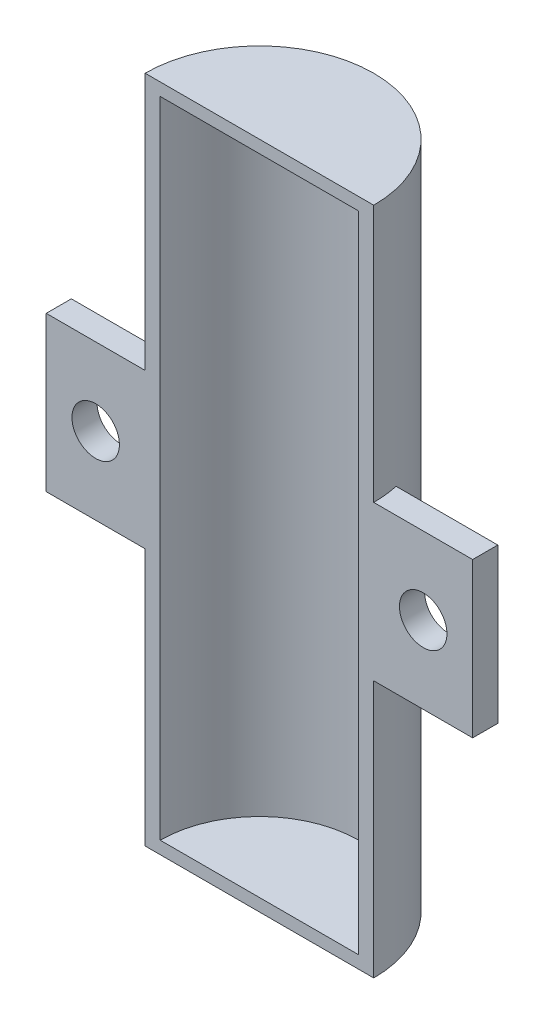
ISO-10303-21;
HEADER;
FILE_DESCRIPTION(('STEP AP214'),'2;1');
FILE_NAME('part.step','',(''),(''),'','','');
FILE_SCHEMA(('AUTOMOTIVE_DESIGN { 1 0 10303 214 1 1 1 1 }'));
ENDSEC;
DATA;
#1=APPLICATION_CONTEXT('core data for automotive mechanical design processes');
#2=APPLICATION_PROTOCOL_DEFINITION('international standard','automotive_design',2000,#1);
#3=PRODUCT_CONTEXT('',#1,'mechanical');
#4=PRODUCT('Part','Part','',(#3));
#5=PRODUCT_RELATED_PRODUCT_CATEGORY('part','',(#4));
#6=PRODUCT_DEFINITION_FORMATION('','',#4);
#7=PRODUCT_DEFINITION_CONTEXT('part definition',#1,'design');
#8=PRODUCT_DEFINITION('design','',#6,#7);
#9=PRODUCT_DEFINITION_SHAPE('','',#8);
#10=(LENGTH_UNIT() NAMED_UNIT(*) SI_UNIT(.MILLI.,.METRE.));
#11=(NAMED_UNIT(*) PLANE_ANGLE_UNIT() SI_UNIT($,.RADIAN.));
#12=(NAMED_UNIT(*) SI_UNIT($,.STERADIAN.) SOLID_ANGLE_UNIT());
#13=UNCERTAINTY_MEASURE_WITH_UNIT(LENGTH_MEASURE(1.E-05),#10,'distance_accuracy_value','');
#14=(GEOMETRIC_REPRESENTATION_CONTEXT(3) GLOBAL_UNCERTAINTY_ASSIGNED_CONTEXT((#13)) GLOBAL_UNIT_ASSIGNED_CONTEXT((#10,
#11,#12)) REPRESENTATION_CONTEXT('',''));
#15=CARTESIAN_POINT('',(0.,0.,0.));
#16=DIRECTION('',(0.,0.,1.));
#17=DIRECTION('',(1.,0.,0.));
#18=AXIS2_PLACEMENT_3D('',#15,#16,#17);
#19=CARTESIAN_POINT('',(0.,0.,-2.54));
#20=DIRECTION('',(0.,0.,1.));
#21=DIRECTION('',(1.,0.,0.));
#22=AXIS2_PLACEMENT_3D('',#19,#20,#21);
#23=PLANE('',#22);
#24=DIRECTION('',(1.,0.,0.));
#25=VECTOR('',#24,1.);
#26=CARTESIAN_POINT('',(0.,26.0237388078982,-2.54));
#27=LINE('',#26,#25);
#28=CARTESIAN_POINT('',(11.2744245529428,26.0237388078982,-2.54));
#29=VERTEX_POINT('',#28);
#30=CARTESIAN_POINT('',(21.5570000000016,26.0237388078982,-2.54));
#31=VERTEX_POINT('',#30);
#32=EDGE_CURVE('E126',#29,#31,#27,.T.);
#33=ORIENTED_EDGE('',*,*,#32,.F.);
#34=DIRECTION('',(0.,-1.,0.));
#35=VECTOR('',#34,1.);
#36=CARTESIAN_POINT('',(11.2744245529428,66.3956,-2.54));
#37=LINE('',#36,#35);
#38=CARTESIAN_POINT('',(11.2744245529428,41.6418611921018,-2.54));
#39=VERTEX_POINT('',#38);
#40=EDGE_CURVE('E11',#29,#39,#37,.F.);
#41=ORIENTED_EDGE('',*,*,#40,.T.);
#42=DIRECTION('',(-1.,0.,0.));
#43=VECTOR('',#42,1.);
#44=CARTESIAN_POINT('',(0.,41.6418611921018,-2.54));
#45=LINE('',#44,#43);
#46=CARTESIAN_POINT('',(21.5570000000016,41.6418611921018,-2.54));
#47=VERTEX_POINT('',#46);
#48=EDGE_CURVE('E144',#47,#39,#45,.T.);
#49=ORIENTED_EDGE('',*,*,#48,.F.);
#50=DIRECTION('',(0.,1.,0.));
#51=VECTOR('',#50,1.);
#52=CARTESIAN_POINT('',(21.5570000000016,0.,-2.54));
#53=LINE('',#52,#51);
#54=EDGE_CURVE('E135',#31,#47,#53,.T.);
#55=ORIENTED_EDGE('',*,*,#54,.F.);
#56=EDGE_LOOP('',(#33,#41,#49,#55));
#57=FACE_BOUND('',#56,.T.);
#58=CARTESIAN_POINT('',(16.5570000000008,33.8328,-2.54));
#59=DIRECTION('',(0.,0.,-1.));
#60=DIRECTION('',(-1.,0.,0.));
#61=AXIS2_PLACEMENT_3D('',#58,#59,#60);
#62=CIRCLE('',#61,2.4);
#63=CARTESIAN_POINT('',(14.1570000000008,33.8328,-2.54));
#64=VERTEX_POINT('',#63);
#65=EDGE_CURVE('E342',#64,#64,#62,.T.);
#66=ORIENTED_EDGE('',*,*,#65,.F.);
#67=EDGE_LOOP('',(#66));
#68=FACE_BOUND('',#67,.T.);
#69=ADVANCED_FACE('F40',(#57,#68),#23,.F.);
#70=CARTESIAN_POINT('',(0.,0.,-2.54));
#71=DIRECTION('',(0.,0.,1.));
#72=DIRECTION('',(1.,0.,0.));
#73=AXIS2_PLACEMENT_3D('',#70,#71,#72);
#74=PLANE('',#73);
#75=DIRECTION('',(-1.,0.,0.));
#76=VECTOR('',#75,1.);
#77=CARTESIAN_POINT('',(0.,41.6418611921018,-2.54));
#78=LINE('',#77,#76);
#79=CARTESIAN_POINT('',(-11.2744245529428,41.6418611921018,-2.54));
#80=VERTEX_POINT('',#79);
#81=CARTESIAN_POINT('',(-21.5570000000016,41.6418611921018,-2.54));
#82=VERTEX_POINT('',#81);
#83=EDGE_CURVE('E169',#80,#82,#78,.T.);
#84=ORIENTED_EDGE('',*,*,#83,.F.);
#85=DIRECTION('',(0.,-1.,0.));
#86=VECTOR('',#85,1.);
#87=CARTESIAN_POINT('',(-11.2744245529428,66.3956,-2.54));
#88=LINE('',#87,#86);
#89=CARTESIAN_POINT('',(-11.2744245529428,26.0237388078982,-2.54));
#90=VERTEX_POINT('',#89);
#91=EDGE_CURVE('E48',#80,#90,#88,.T.);
#92=ORIENTED_EDGE('',*,*,#91,.T.);
#93=DIRECTION('',(-1.,0.,0.));
#94=VECTOR('',#93,1.);
#95=CARTESIAN_POINT('',(0.,26.0237388078982,-2.54));
#96=LINE('',#95,#94);
#97=CARTESIAN_POINT('',(-21.5570000000016,26.0237388078982,-2.54));
#98=VERTEX_POINT('',#97);
#99=EDGE_CURVE('E166',#90,#98,#96,.T.);
#100=ORIENTED_EDGE('',*,*,#99,.T.);
#101=DIRECTION('',(0.,1.,0.));
#102=VECTOR('',#101,1.);
#103=CARTESIAN_POINT('',(-21.5570000000016,0.,-2.54));
#104=LINE('',#103,#102);
#105=EDGE_CURVE('E163',#98,#82,#104,.T.);
#106=ORIENTED_EDGE('',*,*,#105,.T.);
#107=EDGE_LOOP('',(#84,#92,#100,#106));
#108=FACE_BOUND('',#107,.T.);
#109=CARTESIAN_POINT('',(-16.5570000000008,33.8328,-2.54));
#110=DIRECTION('',(0.,0.,-1.));
#111=DIRECTION('',(-1.,0.,0.));
#112=AXIS2_PLACEMENT_3D('',#109,#110,#111);
#113=CIRCLE('',#112,2.4);
#114=CARTESIAN_POINT('',(-18.9570000000008,33.8328,-2.54));
#115=VERTEX_POINT('',#114);
#116=EDGE_CURVE('E344',#115,#115,#113,.T.);
#117=ORIENTED_EDGE('',*,*,#116,.F.);
#118=EDGE_LOOP('',(#117));
#119=FACE_BOUND('',#118,.T.);
#120=ADVANCED_FACE('F226',(#108,#119),#74,.F.);
#121=CARTESIAN_POINT('',(0.,66.3956,0.));
#122=DIRECTION('',(0.,-1.,0.));
#123=DIRECTION('',(0.,0.,-1.));
#124=AXIS2_PLACEMENT_3D('',#121,#122,#123);
#125=CYLINDRICAL_SURFACE('',#124,10.033);
#126=CARTESIAN_POINT('',(0.,1.26999999999999,0.));
#127=DIRECTION('',(0.,-1.,0.));
#128=DIRECTION('',(0.,0.,-1.));
#129=AXIS2_PLACEMENT_3D('',#126,#127,#128);
#130=CIRCLE('',#129,10.033);
#131=CARTESIAN_POINT('',(10.033,1.26999999999999,0.));
#132=VERTEX_POINT('',#131);
#133=CARTESIAN_POINT('',(-10.033,1.26999999999999,0.));
#134=VERTEX_POINT('',#133);
#135=EDGE_CURVE('E191',#132,#134,#130,.F.);
#136=ORIENTED_EDGE('',*,*,#135,.F.);
#137=DIRECTION('',(0.,-1.,0.));
#138=VECTOR('',#137,1.);
#139=CARTESIAN_POINT('',(10.033,66.3956,0.));
#140=LINE('',#139,#138);
#141=CARTESIAN_POINT('',(10.033,66.3956,0.));
#142=VERTEX_POINT('',#141);
#143=EDGE_CURVE('E215',#142,#132,#140,.T.);
#144=ORIENTED_EDGE('',*,*,#143,.F.);
#145=CARTESIAN_POINT('',(0.,66.3956,0.));
#146=DIRECTION('',(0.,-1.,0.));
#147=DIRECTION('',(0.,0.,1.));
#148=AXIS2_PLACEMENT_3D('',#145,#146,#147);
#149=CIRCLE('',#148,10.033);
#150=CARTESIAN_POINT('',(-10.033,66.3956,0.));
#151=VERTEX_POINT('',#150);
#152=EDGE_CURVE('E204',#151,#142,#149,.T.);
#153=ORIENTED_EDGE('',*,*,#152,.F.);
#154=DIRECTION('',(0.,-1.,0.));
#155=VECTOR('',#154,1.);
#156=CARTESIAN_POINT('',(-10.033,66.3956,0.));
#157=LINE('',#156,#155);
#158=EDGE_CURVE('E217',#151,#134,#157,.T.);
#159=ORIENTED_EDGE('',*,*,#158,.T.);
#160=EDGE_LOOP('',(#136,#144,#153,#159));
#161=FACE_BOUND('',#160,.T.);
#162=ADVANCED_FACE('F261',(#161),#125,.F.);
#163=CARTESIAN_POINT('',(0.,66.3956,0.));
#164=DIRECTION('',(0.,-1.,0.));
#165=DIRECTION('',(0.,0.,-1.));
#166=AXIS2_PLACEMENT_3D('',#163,#164,#165);
#167=CYLINDRICAL_SURFACE('',#166,11.557);
#168=ORIENTED_EDGE('',*,*,#40,.F.);
#169=CARTESIAN_POINT('',(0.,26.0237388078982,0.));
#170=DIRECTION('',(0.,-1.,0.));
#171=DIRECTION('',(0.,0.,-1.));
#172=AXIS2_PLACEMENT_3D('',#169,#170,#171);
#173=CIRCLE('',#172,11.557);
#174=CARTESIAN_POINT('',(11.557,26.0237388078982,0.));
#175=VERTEX_POINT('',#174);
#176=EDGE_CURVE('E132',#29,#175,#173,.T.);
#177=ORIENTED_EDGE('',*,*,#176,.T.);
#178=DIRECTION('',(0.,-1.,0.));
#179=VECTOR('',#178,1.);
#180=CARTESIAN_POINT('',(11.557,66.3956,0.));
#181=LINE('',#180,#179);
#182=CARTESIAN_POINT('',(11.557,0.,0.));
#183=VERTEX_POINT('',#182);
#184=EDGE_CURVE('E207',#175,#183,#181,.T.);
#185=ORIENTED_EDGE('',*,*,#184,.T.);
#186=CARTESIAN_POINT('',(0.,0.,0.));
#187=DIRECTION('',(0.,1.,0.));
#188=DIRECTION('',(0.,0.,1.));
#189=AXIS2_PLACEMENT_3D('',#186,#187,#188);
#190=CIRCLE('',#189,11.557);
#191=CARTESIAN_POINT('',(-11.557,0.,0.));
#192=VERTEX_POINT('',#191);
#193=EDGE_CURVE('E201',#183,#192,#190,.T.);
#194=ORIENTED_EDGE('',*,*,#193,.T.);
#195=DIRECTION('',(0.,-1.,0.));
#196=VECTOR('',#195,1.);
#197=CARTESIAN_POINT('',(-11.557,66.3956,0.));
#198=LINE('',#197,#196);
#199=CARTESIAN_POINT('',(-11.557,26.0237388078982,0.));
#200=VERTEX_POINT('',#199);
#201=EDGE_CURVE('E219',#200,#192,#198,.T.);
#202=ORIENTED_EDGE('',*,*,#201,.F.);
#203=CARTESIAN_POINT('',(0.,26.0237388078982,0.));
#204=DIRECTION('',(0.,1.,0.));
#205=DIRECTION('',(-1.,0.,0.));
#206=AXIS2_PLACEMENT_3D('',#203,#204,#205);
#207=CIRCLE('',#206,11.557);
#208=EDGE_CURVE('E180',#90,#200,#207,.T.);
#209=ORIENTED_EDGE('',*,*,#208,.F.);
#210=ORIENTED_EDGE('',*,*,#91,.F.);
#211=CARTESIAN_POINT('',(0.,41.6418611921018,0.));
#212=DIRECTION('',(0.,1.,0.));
#213=DIRECTION('',(0.,0.,1.));
#214=AXIS2_PLACEMENT_3D('',#211,#212,#213);
#215=CIRCLE('',#214,11.557);
#216=CARTESIAN_POINT('',(-11.557,41.6418611921018,0.));
#217=VERTEX_POINT('',#216);
#218=EDGE_CURVE('E185',#80,#217,#215,.T.);
#219=ORIENTED_EDGE('',*,*,#218,.T.);
#220=CARTESIAN_POINT('',(-11.557,67.6656,0.));
#221=VERTEX_POINT('',#220);
#222=EDGE_CURVE('E220',#221,#217,#198,.T.);
#223=ORIENTED_EDGE('',*,*,#222,.F.);
#224=CARTESIAN_POINT('',(0.,67.6656,0.));
#225=DIRECTION('',(0.,1.,0.));
#226=DIRECTION('',(0.,0.,1.));
#227=AXIS2_PLACEMENT_3D('',#224,#225,#226);
#228=CIRCLE('',#227,11.557);
#229=CARTESIAN_POINT('',(11.557,67.6656,0.));
#230=VERTEX_POINT('',#229);
#231=EDGE_CURVE('E195',#230,#221,#228,.T.);
#232=ORIENTED_EDGE('',*,*,#231,.F.);
#233=CARTESIAN_POINT('',(11.557,41.6418611921018,0.));
#234=VERTEX_POINT('',#233);
#235=EDGE_CURVE('E213',#230,#234,#181,.T.);
#236=ORIENTED_EDGE('',*,*,#235,.T.);
#237=CARTESIAN_POINT('',(0.,41.6418611921018,0.));
#238=DIRECTION('',(0.,1.,0.));
#239=DIRECTION('',(0.,0.,1.));
#240=AXIS2_PLACEMENT_3D('',#237,#238,#239);
#241=CIRCLE('',#240,11.557);
#242=EDGE_CURVE('E55',#234,#39,#241,.T.);
#243=ORIENTED_EDGE('',*,*,#242,.T.);
#244=EDGE_LOOP('',(#168,#177,#185,#194,#202,#209,#210,#219,#223,#232,#236,#243));
#245=FACE_BOUND('',#244,.T.);
#246=ADVANCED_FACE('F42',(#245),#167,.T.);
#247=CARTESIAN_POINT('',(10.033,66.3956,0.));
#248=DIRECTION('',(0.,0.,-1.));
#249=DIRECTION('',(-1.,0.,0.));
#250=AXIS2_PLACEMENT_3D('',#247,#248,#249);
#251=PLANE('',#250);
#252=CARTESIAN_POINT('',(16.5570000000008,33.8328,0.));
#253=DIRECTION('',(0.,0.,-1.));
#254=DIRECTION('',(-1.,0.,0.));
#255=AXIS2_PLACEMENT_3D('',#252,#253,#254);
#256=CIRCLE('',#255,2.4);
#257=CARTESIAN_POINT('',(14.1570000000008,33.8328,0.));
#258=VERTEX_POINT('',#257);
#259=EDGE_CURVE('E339',#258,#258,#256,.T.);
#260=ORIENTED_EDGE('',*,*,#259,.T.);
#261=EDGE_LOOP('',(#260));
#262=FACE_BOUND('',#261,.T.);
#263=CARTESIAN_POINT('',(-16.5570000000008,33.8328,0.));
#264=DIRECTION('',(0.,0.,-1.));
#265=DIRECTION('',(-1.,0.,0.));
#266=AXIS2_PLACEMENT_3D('',#263,#264,#265);
#267=CIRCLE('',#266,2.4);
#268=CARTESIAN_POINT('',(-18.9570000000008,33.8328,0.));
#269=VERTEX_POINT('',#268);
#270=EDGE_CURVE('E155',#269,#269,#267,.T.);
#271=ORIENTED_EDGE('',*,*,#270,.T.);
#272=EDGE_LOOP('',(#271));
#273=FACE_BOUND('',#272,.T.);
#274=ORIENTED_EDGE('',*,*,#143,.T.);
#275=DIRECTION('',(1.,0.,0.));
#276=VECTOR('',#275,1.);
#277=CARTESIAN_POINT('',(-11.557,1.26999999999999,0.));
#278=LINE('',#277,#276);
#279=EDGE_CURVE('E188',#134,#132,#278,.T.);
#280=ORIENTED_EDGE('',*,*,#279,.F.);
#281=ORIENTED_EDGE('',*,*,#158,.F.);
#282=DIRECTION('',(1.,0.,0.));
#283=VECTOR('',#282,1.);
#284=CARTESIAN_POINT('',(-11.557,66.3956,0.));
#285=LINE('',#284,#283);
#286=EDGE_CURVE('E194',#151,#142,#285,.T.);
#287=ORIENTED_EDGE('',*,*,#286,.T.);
#288=EDGE_LOOP('',(#274,#280,#281,#287));
#289=FACE_BOUND('',#288,.T.);
#290=ORIENTED_EDGE('',*,*,#184,.F.);
#291=DIRECTION('',(1.,0.,0.));
#292=VECTOR('',#291,1.);
#293=CARTESIAN_POINT('',(0.,26.0237388078982,0.));
#294=LINE('',#293,#292);
#295=CARTESIAN_POINT('',(21.5570000000016,26.0237388078982,0.));
#296=VERTEX_POINT('',#295);
#297=EDGE_CURVE('E153',#175,#296,#294,.T.);
#298=ORIENTED_EDGE('',*,*,#297,.T.);
#299=DIRECTION('',(0.,1.,0.));
#300=VECTOR('',#299,1.);
#301=CARTESIAN_POINT('',(21.5570000000016,0.,0.));
#302=LINE('',#301,#300);
#303=CARTESIAN_POINT('',(21.5570000000016,41.6418611921018,0.));
#304=VERTEX_POINT('',#303);
#305=EDGE_CURVE('E142',#296,#304,#302,.T.);
#306=ORIENTED_EDGE('',*,*,#305,.T.);
#307=DIRECTION('',(-1.,0.,0.));
#308=VECTOR('',#307,1.);
#309=CARTESIAN_POINT('',(0.,41.6418611921018,0.));
#310=LINE('',#309,#308);
#311=EDGE_CURVE('E136',#304,#234,#310,.T.);
#312=ORIENTED_EDGE('',*,*,#311,.T.);
#313=ORIENTED_EDGE('',*,*,#235,.F.);
#314=DIRECTION('',(1.,0.,0.));
#315=VECTOR('',#314,1.);
#316=CARTESIAN_POINT('',(-11.557,67.6656,0.));
#317=LINE('',#316,#315);
#318=EDGE_CURVE('E198',#221,#230,#317,.T.);
#319=ORIENTED_EDGE('',*,*,#318,.F.);
#320=ORIENTED_EDGE('',*,*,#222,.T.);
#321=DIRECTION('',(-1.,0.,0.));
#322=VECTOR('',#321,1.);
#323=CARTESIAN_POINT('',(0.,41.6418611921018,0.));
#324=LINE('',#323,#322);
#325=CARTESIAN_POINT('',(-21.5570000000016,41.6418611921018,0.));
#326=VERTEX_POINT('',#325);
#327=EDGE_CURVE('E167',#217,#326,#324,.T.);
#328=ORIENTED_EDGE('',*,*,#327,.T.);
#329=DIRECTION('',(0.,1.,0.));
#330=VECTOR('',#329,1.);
#331=CARTESIAN_POINT('',(-21.5570000000016,0.,0.));
#332=LINE('',#331,#330);
#333=CARTESIAN_POINT('',(-21.5570000000016,26.0237388078982,0.));
#334=VERTEX_POINT('',#333);
#335=EDGE_CURVE('E162',#334,#326,#332,.T.);
#336=ORIENTED_EDGE('',*,*,#335,.F.);
#337=DIRECTION('',(-1.,0.,0.));
#338=VECTOR('',#337,1.);
#339=CARTESIAN_POINT('',(0.,26.0237388078982,0.));
#340=LINE('',#339,#338);
#341=EDGE_CURVE('E174',#200,#334,#340,.T.);
#342=ORIENTED_EDGE('',*,*,#341,.F.);
#343=ORIENTED_EDGE('',*,*,#201,.T.);
#344=DIRECTION('',(1.,0.,0.));
#345=VECTOR('',#344,1.);
#346=CARTESIAN_POINT('',(10.033,0.,0.));
#347=LINE('',#346,#345);
#348=EDGE_CURVE('E208',#192,#183,#347,.T.);
#349=ORIENTED_EDGE('',*,*,#348,.T.);
#350=EDGE_LOOP('',(#290,#298,#306,#312,#313,#319,#320,#328,#336,#342,#343,#349));
#351=FACE_BOUND('',#350,.T.);
#352=ADVANCED_FACE('F237',(#262,#273,#289,#351),#251,.F.);
#353=CARTESIAN_POINT('',(0.,0.,0.));
#354=DIRECTION('',(0.,1.,0.));
#355=DIRECTION('',(0.,0.,1.));
#356=AXIS2_PLACEMENT_3D('',#353,#354,#355);
#357=PLANE('',#356);
#358=ORIENTED_EDGE('',*,*,#193,.F.);
#359=ORIENTED_EDGE('',*,*,#348,.F.);
#360=EDGE_LOOP('',(#358,#359));
#361=FACE_BOUND('',#360,.T.);
#362=ADVANCED_FACE('F240',(#361),#357,.F.);
#363=CARTESIAN_POINT('',(0.,66.3956,0.));
#364=DIRECTION('',(0.,1.,0.));
#365=DIRECTION('',(0.,0.,1.));
#366=AXIS2_PLACEMENT_3D('',#363,#364,#365);
#367=PLANE('',#366);
#368=ORIENTED_EDGE('',*,*,#286,.F.);
#369=ORIENTED_EDGE('',*,*,#152,.T.);
#370=EDGE_LOOP('',(#368,#369));
#371=FACE_BOUND('',#370,.T.);
#372=ADVANCED_FACE('F242',(#371),#367,.F.);
#373=CARTESIAN_POINT('',(0.,67.6656,0.));
#374=DIRECTION('',(0.,1.,0.));
#375=DIRECTION('',(0.,0.,1.));
#376=AXIS2_PLACEMENT_3D('',#373,#374,#375);
#377=PLANE('',#376);
#378=ORIENTED_EDGE('',*,*,#231,.T.);
#379=ORIENTED_EDGE('',*,*,#318,.T.);
#380=EDGE_LOOP('',(#378,#379));
#381=FACE_BOUND('',#380,.T.);
#382=ADVANCED_FACE('F249',(#381),#377,.T.);
#383=CARTESIAN_POINT('',(0.,1.26999999999999,0.));
#384=DIRECTION('',(0.,-1.,0.));
#385=DIRECTION('',(0.,0.,1.));
#386=AXIS2_PLACEMENT_3D('',#383,#384,#385);
#387=PLANE('',#386);
#388=ORIENTED_EDGE('',*,*,#279,.T.);
#389=ORIENTED_EDGE('',*,*,#135,.T.);
#390=EDGE_LOOP('',(#388,#389));
#391=FACE_BOUND('',#390,.T.);
#392=ADVANCED_FACE('F279',(#391),#387,.F.);
#393=CARTESIAN_POINT('',(0.,41.6418611921018,-2.54));
#394=DIRECTION('',(0.,1.,0.));
#395=DIRECTION('',(0.,0.,1.));
#396=AXIS2_PLACEMENT_3D('',#393,#394,#395);
#397=PLANE('',#396);
#398=ORIENTED_EDGE('',*,*,#218,.F.);
#399=ORIENTED_EDGE('',*,*,#83,.T.);
#400=DIRECTION('',(0.,0.,1.));
#401=VECTOR('',#400,1.);
#402=CARTESIAN_POINT('',(-21.5570000000016,41.6418611921018,-2.54));
#403=LINE('',#402,#401);
#404=EDGE_CURVE('E177',#82,#326,#403,.T.);
#405=ORIENTED_EDGE('',*,*,#404,.T.);
#406=ORIENTED_EDGE('',*,*,#327,.F.);
#407=EDGE_LOOP('',(#398,#399,#405,#406));
#408=FACE_BOUND('',#407,.T.);
#409=ADVANCED_FACE('F276',(#408),#397,.T.);
#410=CARTESIAN_POINT('',(0.,26.0237388078982,-2.54));
#411=DIRECTION('',(0.,1.,0.));
#412=DIRECTION('',(-1.,0.,0.));
#413=AXIS2_PLACEMENT_3D('',#410,#411,#412);
#414=PLANE('',#413);
#415=ORIENTED_EDGE('',*,*,#99,.F.);
#416=ORIENTED_EDGE('',*,*,#208,.T.);
#417=ORIENTED_EDGE('',*,*,#341,.T.);
#418=DIRECTION('',(0.,0.,1.));
#419=VECTOR('',#418,1.);
#420=CARTESIAN_POINT('',(-21.5570000000016,26.0237388078982,-2.54));
#421=LINE('',#420,#419);
#422=EDGE_CURVE('E171',#98,#334,#421,.T.);
#423=ORIENTED_EDGE('',*,*,#422,.F.);
#424=EDGE_LOOP('',(#415,#416,#417,#423));
#425=FACE_BOUND('',#424,.T.);
#426=ADVANCED_FACE('F231',(#425),#414,.F.);
#427=CARTESIAN_POINT('',(-21.5570000000016,0.,-2.54));
#428=DIRECTION('',(1.,0.,0.));
#429=DIRECTION('',(0.,0.,-1.));
#430=AXIS2_PLACEMENT_3D('',#427,#428,#429);
#431=PLANE('',#430);
#432=ORIENTED_EDGE('',*,*,#335,.T.);
#433=ORIENTED_EDGE('',*,*,#404,.F.);
#434=ORIENTED_EDGE('',*,*,#105,.F.);
#435=ORIENTED_EDGE('',*,*,#422,.T.);
#436=EDGE_LOOP('',(#432,#433,#434,#435));
#437=FACE_BOUND('',#436,.T.);
#438=ADVANCED_FACE('F274',(#437),#431,.F.);
#439=CARTESIAN_POINT('',(0.,26.0237388078982,-2.54));
#440=DIRECTION('',(0.,-1.,0.));
#441=DIRECTION('',(0.,0.,-1.));
#442=AXIS2_PLACEMENT_3D('',#439,#440,#441);
#443=PLANE('',#442);
#444=ORIENTED_EDGE('',*,*,#176,.F.);
#445=ORIENTED_EDGE('',*,*,#32,.T.);
#446=DIRECTION('',(0.,0.,1.));
#447=VECTOR('',#446,1.);
#448=CARTESIAN_POINT('',(21.5570000000016,26.0237388078982,-2.54));
#449=LINE('',#448,#447);
#450=EDGE_CURVE('E130',#31,#296,#449,.T.);
#451=ORIENTED_EDGE('',*,*,#450,.T.);
#452=ORIENTED_EDGE('',*,*,#297,.F.);
#453=EDGE_LOOP('',(#444,#445,#451,#452));
#454=FACE_BOUND('',#453,.T.);
#455=ADVANCED_FACE('F128',(#454),#443,.T.);
#456=CARTESIAN_POINT('',(0.,41.6418611921018,-2.54));
#457=DIRECTION('',(0.,1.,0.));
#458=DIRECTION('',(0.,0.,1.));
#459=AXIS2_PLACEMENT_3D('',#456,#457,#458);
#460=PLANE('',#459);
#461=ORIENTED_EDGE('',*,*,#242,.F.);
#462=ORIENTED_EDGE('',*,*,#311,.F.);
#463=DIRECTION('',(0.,0.,1.));
#464=VECTOR('',#463,1.);
#465=CARTESIAN_POINT('',(21.5570000000016,41.6418611921018,-2.54));
#466=LINE('',#465,#464);
#467=EDGE_CURVE('E143',#47,#304,#466,.T.);
#468=ORIENTED_EDGE('',*,*,#467,.F.);
#469=ORIENTED_EDGE('',*,*,#48,.T.);
#470=EDGE_LOOP('',(#461,#462,#468,#469));
#471=FACE_BOUND('',#470,.T.);
#472=ADVANCED_FACE('F267',(#471),#460,.T.);
#473=CARTESIAN_POINT('',(21.5570000000016,0.,-2.54));
#474=DIRECTION('',(1.,0.,0.));
#475=DIRECTION('',(0.,0.,-1.));
#476=AXIS2_PLACEMENT_3D('',#473,#474,#475);
#477=PLANE('',#476);
#478=ORIENTED_EDGE('',*,*,#305,.F.);
#479=ORIENTED_EDGE('',*,*,#450,.F.);
#480=ORIENTED_EDGE('',*,*,#54,.T.);
#481=ORIENTED_EDGE('',*,*,#467,.T.);
#482=EDGE_LOOP('',(#478,#479,#480,#481));
#483=FACE_BOUND('',#482,.T.);
#484=ADVANCED_FACE('F140',(#483),#477,.T.);
#485=CARTESIAN_POINT('',(-16.5570000000008,33.8328,-2.54));
#486=DIRECTION('',(0.,0.,-1.));
#487=DIRECTION('',(-1.,0.,0.));
#488=AXIS2_PLACEMENT_3D('',#485,#486,#487);
#489=CYLINDRICAL_SURFACE('',#488,2.4);
#490=ORIENTED_EDGE('',*,*,#270,.F.);
#491=EDGE_LOOP('',(#490));
#492=FACE_BOUND('',#491,.T.);
#493=ORIENTED_EDGE('',*,*,#116,.T.);
#494=EDGE_LOOP('',(#493));
#495=FACE_BOUND('',#494,.T.);
#496=ADVANCED_FACE('F265',(#492,#495),#489,.F.);
#497=CARTESIAN_POINT('',(16.5570000000008,33.8328,-2.54));
#498=DIRECTION('',(0.,0.,-1.));
#499=DIRECTION('',(-1.,0.,0.));
#500=AXIS2_PLACEMENT_3D('',#497,#498,#499);
#501=CYLINDRICAL_SURFACE('',#500,2.4);
#502=ORIENTED_EDGE('',*,*,#259,.F.);
#503=EDGE_LOOP('',(#502));
#504=FACE_BOUND('',#503,.T.);
#505=ORIENTED_EDGE('',*,*,#65,.T.);
#506=EDGE_LOOP('',(#505));
#507=FACE_BOUND('',#506,.T.);
#508=ADVANCED_FACE('F323',(#504,#507),#501,.F.);
#509=CLOSED_SHELL('',(#69,#120,#162,#246,#352,#362,#372,#382,#392,#409,#426,#438,#455,#472,#484,
#496,#508));
#510=MANIFOLD_SOLID_BREP('B2',#509);
#511=ADVANCED_BREP_SHAPE_REPRESENTATION('',(#18,#510),#14);
#512=SHAPE_DEFINITION_REPRESENTATION(#9,#511);
ENDSEC;
END-ISO-10303-21;
